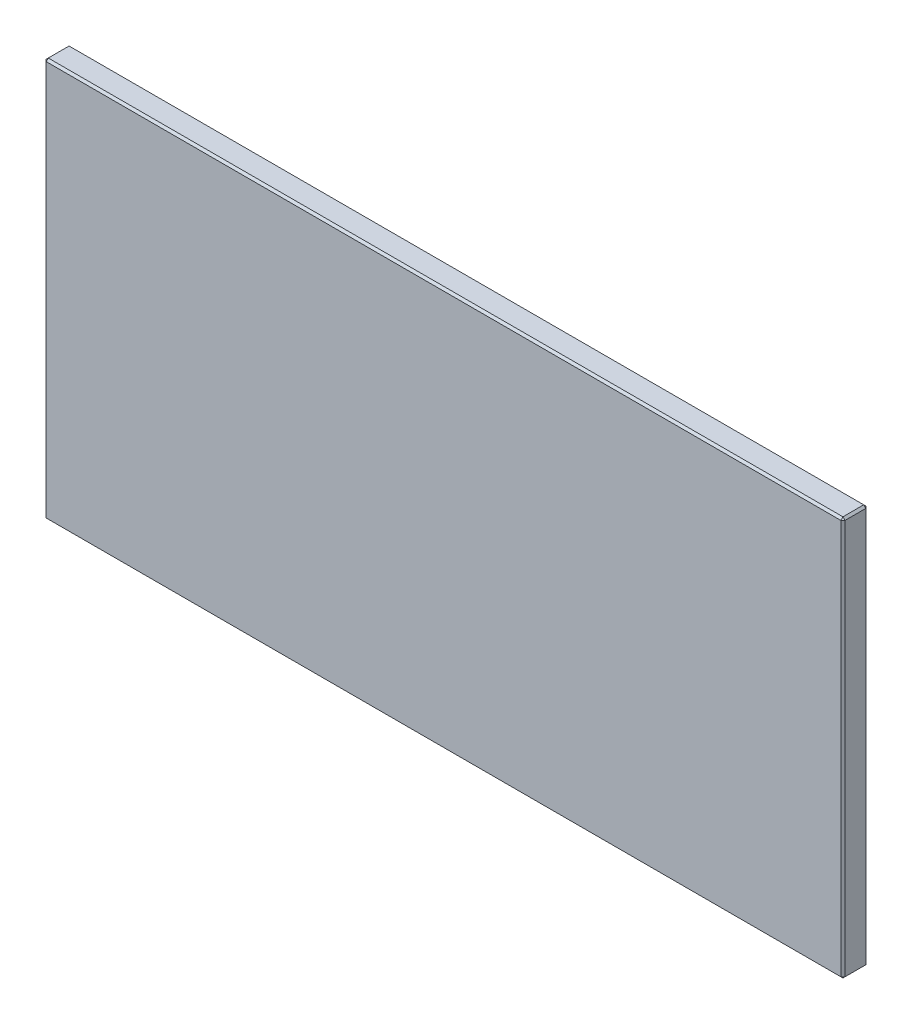
ISO-10303-21;
HEADER;
FILE_DESCRIPTION(('STEP AP214'),'2;1');
FILE_NAME('part.step','',(''),(''),'','','');
FILE_SCHEMA(('AUTOMOTIVE_DESIGN { 1 0 10303 214 1 1 1 1 }'));
ENDSEC;
DATA;
#1=APPLICATION_CONTEXT('core data for automotive mechanical design processes');
#2=APPLICATION_PROTOCOL_DEFINITION('international standard','automotive_design',2000,#1);
#3=PRODUCT_CONTEXT('',#1,'mechanical');
#4=PRODUCT('Part','Part','',(#3));
#5=PRODUCT_RELATED_PRODUCT_CATEGORY('part','',(#4));
#6=PRODUCT_DEFINITION_FORMATION('','',#4);
#7=PRODUCT_DEFINITION_CONTEXT('part definition',#1,'design');
#8=PRODUCT_DEFINITION('design','',#6,#7);
#9=PRODUCT_DEFINITION_SHAPE('','',#8);
#10=(LENGTH_UNIT() NAMED_UNIT(*) SI_UNIT(.MILLI.,.METRE.));
#11=(NAMED_UNIT(*) PLANE_ANGLE_UNIT() SI_UNIT($,.RADIAN.));
#12=(NAMED_UNIT(*) SI_UNIT($,.STERADIAN.) SOLID_ANGLE_UNIT());
#13=UNCERTAINTY_MEASURE_WITH_UNIT(LENGTH_MEASURE(1.E-05),#10,'distance_accuracy_value','');
#14=(GEOMETRIC_REPRESENTATION_CONTEXT(3) GLOBAL_UNCERTAINTY_ASSIGNED_CONTEXT((#13)) GLOBAL_UNIT_ASSIGNED_CONTEXT((#10,
#11,#12)) REPRESENTATION_CONTEXT('',''));
#15=CARTESIAN_POINT('',(0.,0.,0.));
#16=DIRECTION('',(0.,0.,1.));
#17=DIRECTION('',(1.,0.,0.));
#18=AXIS2_PLACEMENT_3D('',#15,#16,#17);
#19=CARTESIAN_POINT('',(-609.6,304.8,38.1));
#20=DIRECTION('',(1.,0.,0.));
#21=DIRECTION('',(0.,1.,0.));
#22=AXIS2_PLACEMENT_3D('',#19,#20,#21);
#23=PLANE('',#22);
#24=DIRECTION('',(0.,1.,0.));
#25=VECTOR('',#24,1.);
#26=CARTESIAN_POINT('',(-609.6,304.8,34.9249999999999));
#27=LINE('',#26,#25);
#28=CARTESIAN_POINT('',(-609.6,-301.625,34.9249999999999));
#29=VERTEX_POINT('',#28);
#30=CARTESIAN_POINT('',(-609.6,301.625,34.9249999999999));
#31=VERTEX_POINT('',#30);
#32=EDGE_CURVE('E41',#29,#31,#27,.T.);
#33=ORIENTED_EDGE('',*,*,#32,.T.);
#34=DIRECTION('',(0.,0.,-1.));
#35=VECTOR('',#34,1.);
#36=CARTESIAN_POINT('',(-609.6,301.625,38.1));
#37=LINE('',#36,#35);
#38=CARTESIAN_POINT('',(-609.6,301.625,3.17500000000005));
#39=VERTEX_POINT('',#38);
#40=EDGE_CURVE('E12',#31,#39,#37,.T.);
#41=ORIENTED_EDGE('',*,*,#40,.T.);
#42=DIRECTION('',(0.,-1.,0.));
#43=VECTOR('',#42,1.);
#44=CARTESIAN_POINT('',(-609.6,304.8,3.17500000000005));
#45=LINE('',#44,#43);
#46=CARTESIAN_POINT('',(-609.6,-301.625,3.17500000000005));
#47=VERTEX_POINT('',#46);
#48=EDGE_CURVE('E193',#39,#47,#45,.T.);
#49=ORIENTED_EDGE('',*,*,#48,.T.);
#50=DIRECTION('',(0.,0.,1.));
#51=VECTOR('',#50,1.);
#52=CARTESIAN_POINT('',(-609.6,-301.625,38.1));
#53=LINE('',#52,#51);
#54=EDGE_CURVE('E51',#47,#29,#53,.T.);
#55=ORIENTED_EDGE('',*,*,#54,.T.);
#56=EDGE_LOOP('',(#33,#41,#49,#55));
#57=FACE_BOUND('',#56,.T.);
#58=ADVANCED_FACE('F34',(#57),#23,.F.);
#59=CARTESIAN_POINT('',(-609.6,-304.8,38.1));
#60=DIRECTION('',(0.,1.,0.));
#61=DIRECTION('',(-1.,0.,0.));
#62=AXIS2_PLACEMENT_3D('',#59,#60,#61);
#63=PLANE('',#62);
#64=DIRECTION('',(0.,0.,1.));
#65=VECTOR('',#64,1.);
#66=CARTESIAN_POINT('',(606.425,-304.8,38.1));
#67=LINE('',#66,#65);
#68=CARTESIAN_POINT('',(606.425,-304.8,3.17500000000005));
#69=VERTEX_POINT('',#68);
#70=CARTESIAN_POINT('',(606.425,-304.8,34.925));
#71=VERTEX_POINT('',#70);
#72=EDGE_CURVE('E179',#69,#71,#67,.T.);
#73=ORIENTED_EDGE('',*,*,#72,.T.);
#74=DIRECTION('',(-1.,0.,0.));
#75=VECTOR('',#74,1.);
#76=CARTESIAN_POINT('',(-609.6,-304.8,34.925));
#77=LINE('',#76,#75);
#78=CARTESIAN_POINT('',(-606.425,-304.8,34.925));
#79=VERTEX_POINT('',#78);
#80=EDGE_CURVE('E181',#71,#79,#77,.T.);
#81=ORIENTED_EDGE('',*,*,#80,.T.);
#82=DIRECTION('',(0.,0.,-1.));
#83=VECTOR('',#82,1.);
#84=CARTESIAN_POINT('',(-606.425,-304.8,38.1));
#85=LINE('',#84,#83);
#86=CARTESIAN_POINT('',(-606.425,-304.8,3.17500000000005));
#87=VERTEX_POINT('',#86);
#88=EDGE_CURVE('E175',#79,#87,#85,.T.);
#89=ORIENTED_EDGE('',*,*,#88,.T.);
#90=DIRECTION('',(1.,0.,0.));
#91=VECTOR('',#90,1.);
#92=CARTESIAN_POINT('',(-609.6,-304.8,3.17500000000005));
#93=LINE('',#92,#91);
#94=EDGE_CURVE('E177',#87,#69,#93,.T.);
#95=ORIENTED_EDGE('',*,*,#94,.T.);
#96=EDGE_LOOP('',(#73,#81,#89,#95));
#97=FACE_BOUND('',#96,.T.);
#98=ADVANCED_FACE('F318',(#97),#63,.F.);
#99=CARTESIAN_POINT('',(609.6,304.8,38.1));
#100=DIRECTION('',(-1.,0.,0.));
#101=DIRECTION('',(0.,0.,1.));
#102=AXIS2_PLACEMENT_3D('',#99,#100,#101);
#103=PLANE('',#102);
#104=DIRECTION('',(0.,0.,1.));
#105=VECTOR('',#104,1.);
#106=CARTESIAN_POINT('',(609.6,301.625,38.1));
#107=LINE('',#106,#105);
#108=CARTESIAN_POINT('',(609.6,301.625,3.17500000000005));
#109=VERTEX_POINT('',#108);
#110=CARTESIAN_POINT('',(609.6,301.625,34.925));
#111=VERTEX_POINT('',#110);
#112=EDGE_CURVE('E170',#109,#111,#107,.T.);
#113=ORIENTED_EDGE('',*,*,#112,.T.);
#114=DIRECTION('',(0.,-1.,0.));
#115=VECTOR('',#114,1.);
#116=CARTESIAN_POINT('',(609.6,-304.8,34.925));
#117=LINE('',#116,#115);
#118=CARTESIAN_POINT('',(609.6,-301.625,34.925));
#119=VERTEX_POINT('',#118);
#120=EDGE_CURVE('E172',#111,#119,#117,.T.);
#121=ORIENTED_EDGE('',*,*,#120,.T.);
#122=DIRECTION('',(0.,0.,-1.));
#123=VECTOR('',#122,1.);
#124=CARTESIAN_POINT('',(609.6,-301.625,38.1));
#125=LINE('',#124,#123);
#126=CARTESIAN_POINT('',(609.6,-301.625,3.17500000000005));
#127=VERTEX_POINT('',#126);
#128=EDGE_CURVE('E168',#119,#127,#125,.T.);
#129=ORIENTED_EDGE('',*,*,#128,.T.);
#130=DIRECTION('',(0.,1.,0.));
#131=VECTOR('',#130,1.);
#132=CARTESIAN_POINT('',(609.6,304.8,3.17500000000005));
#133=LINE('',#132,#131);
#134=EDGE_CURVE('E166',#127,#109,#133,.T.);
#135=ORIENTED_EDGE('',*,*,#134,.T.);
#136=EDGE_LOOP('',(#113,#121,#129,#135));
#137=FACE_BOUND('',#136,.T.);
#138=ADVANCED_FACE('F322',(#137),#103,.F.);
#139=CARTESIAN_POINT('',(-609.6,304.8,38.1));
#140=DIRECTION('',(0.,-1.,0.));
#141=DIRECTION('',(0.,0.,-1.));
#142=AXIS2_PLACEMENT_3D('',#139,#140,#141);
#143=PLANE('',#142);
#144=DIRECTION('',(0.,0.,1.));
#145=VECTOR('',#144,1.);
#146=CARTESIAN_POINT('',(-606.425,304.8,38.1));
#147=LINE('',#146,#145);
#148=CARTESIAN_POINT('',(-606.425,304.8,3.17500000000005));
#149=VERTEX_POINT('',#148);
#150=CARTESIAN_POINT('',(-606.425,304.8,34.925));
#151=VERTEX_POINT('',#150);
#152=EDGE_CURVE('E155',#149,#151,#147,.T.);
#153=ORIENTED_EDGE('',*,*,#152,.T.);
#154=DIRECTION('',(1.,0.,0.));
#155=VECTOR('',#154,1.);
#156=CARTESIAN_POINT('',(609.6,304.8,34.925));
#157=LINE('',#156,#155);
#158=CARTESIAN_POINT('',(606.425,304.8,34.925));
#159=VERTEX_POINT('',#158);
#160=EDGE_CURVE('E127',#151,#159,#157,.T.);
#161=ORIENTED_EDGE('',*,*,#160,.T.);
#162=DIRECTION('',(0.,0.,-1.));
#163=VECTOR('',#162,1.);
#164=CARTESIAN_POINT('',(606.425,304.8,38.1));
#165=LINE('',#164,#163);
#166=CARTESIAN_POINT('',(606.425,304.8,3.17500000000005));
#167=VERTEX_POINT('',#166);
#168=EDGE_CURVE('E163',#159,#167,#165,.T.);
#169=ORIENTED_EDGE('',*,*,#168,.T.);
#170=DIRECTION('',(-1.,0.,0.));
#171=VECTOR('',#170,1.);
#172=CARTESIAN_POINT('',(-609.6,304.8,3.17500000000005));
#173=LINE('',#172,#171);
#174=EDGE_CURVE('E157',#167,#149,#173,.T.);
#175=ORIENTED_EDGE('',*,*,#174,.T.);
#176=EDGE_LOOP('',(#153,#161,#169,#175));
#177=FACE_BOUND('',#176,.T.);
#178=ADVANCED_FACE('F288',(#177),#143,.F.);
#179=CARTESIAN_POINT('',(-609.6,304.8,38.1));
#180=DIRECTION('',(0.,0.,1.));
#181=DIRECTION('',(1.,0.,0.));
#182=AXIS2_PLACEMENT_3D('',#179,#180,#181);
#183=PLANE('',#182);
#184=DIRECTION('',(0.,1.,0.));
#185=VECTOR('',#184,1.);
#186=CARTESIAN_POINT('',(606.425,304.8,38.1));
#187=LINE('',#186,#185);
#188=CARTESIAN_POINT('',(606.425,-301.625,38.1));
#189=VERTEX_POINT('',#188);
#190=CARTESIAN_POINT('',(606.425,301.625,38.1));
#191=VERTEX_POINT('',#190);
#192=EDGE_CURVE('E153',#189,#191,#187,.T.);
#193=ORIENTED_EDGE('',*,*,#192,.T.);
#194=DIRECTION('',(-1.,0.,0.));
#195=VECTOR('',#194,1.);
#196=CARTESIAN_POINT('',(-609.6,301.625,38.1));
#197=LINE('',#196,#195);
#198=CARTESIAN_POINT('',(-606.425,301.625,38.1));
#199=VERTEX_POINT('',#198);
#200=EDGE_CURVE('E125',#191,#199,#197,.T.);
#201=ORIENTED_EDGE('',*,*,#200,.T.);
#202=DIRECTION('',(0.,-1.,0.));
#203=VECTOR('',#202,1.);
#204=CARTESIAN_POINT('',(-606.425,-304.8,38.1));
#205=LINE('',#204,#203);
#206=CARTESIAN_POINT('',(-606.425,-301.625,38.1));
#207=VERTEX_POINT('',#206);
#208=EDGE_CURVE('E142',#199,#207,#205,.T.);
#209=ORIENTED_EDGE('',*,*,#208,.T.);
#210=DIRECTION('',(1.,0.,0.));
#211=VECTOR('',#210,1.);
#212=CARTESIAN_POINT('',(609.6,-301.625,38.1));
#213=LINE('',#212,#211);
#214=EDGE_CURVE('E148',#207,#189,#213,.T.);
#215=ORIENTED_EDGE('',*,*,#214,.T.);
#216=EDGE_LOOP('',(#193,#201,#209,#215));
#217=FACE_BOUND('',#216,.T.);
#218=ADVANCED_FACE('F151',(#217),#183,.T.);
#219=CARTESIAN_POINT('',(-609.6,304.8,0.));
#220=DIRECTION('',(0.,0.,1.));
#221=DIRECTION('',(1.,0.,0.));
#222=AXIS2_PLACEMENT_3D('',#219,#220,#221);
#223=PLANE('',#222);
#224=DIRECTION('',(0.,-1.,0.));
#225=VECTOR('',#224,1.);
#226=CARTESIAN_POINT('',(606.425,304.8,0.));
#227=LINE('',#226,#225);
#228=CARTESIAN_POINT('',(606.425,301.625,0.));
#229=VERTEX_POINT('',#228);
#230=CARTESIAN_POINT('',(606.425,-301.625,0.));
#231=VERTEX_POINT('',#230);
#232=EDGE_CURVE('E188',#229,#231,#227,.T.);
#233=ORIENTED_EDGE('',*,*,#232,.T.);
#234=DIRECTION('',(-1.,0.,0.));
#235=VECTOR('',#234,1.);
#236=CARTESIAN_POINT('',(-609.6,-301.625,0.));
#237=LINE('',#236,#235);
#238=CARTESIAN_POINT('',(-606.425,-301.625,0.));
#239=VERTEX_POINT('',#238);
#240=EDGE_CURVE('E190',#231,#239,#237,.T.);
#241=ORIENTED_EDGE('',*,*,#240,.T.);
#242=DIRECTION('',(0.,1.,0.));
#243=VECTOR('',#242,1.);
#244=CARTESIAN_POINT('',(-606.425,304.8,0.));
#245=LINE('',#244,#243);
#246=CARTESIAN_POINT('',(-606.425,301.625,0.));
#247=VERTEX_POINT('',#246);
#248=EDGE_CURVE('E184',#239,#247,#245,.T.);
#249=ORIENTED_EDGE('',*,*,#248,.T.);
#250=DIRECTION('',(1.,0.,0.));
#251=VECTOR('',#250,1.);
#252=CARTESIAN_POINT('',(-609.6,301.625,0.));
#253=LINE('',#252,#251);
#254=EDGE_CURVE('E186',#247,#229,#253,.T.);
#255=ORIENTED_EDGE('',*,*,#254,.T.);
#256=EDGE_LOOP('',(#233,#241,#249,#255));
#257=FACE_BOUND('',#256,.T.);
#258=ADVANCED_FACE('F302',(#257),#223,.F.);
#259=CARTESIAN_POINT('',(-609.6,-304.8,3.17500000000005));
#260=DIRECTION('',(0.,0.707106781186549,0.707106781186546));
#261=DIRECTION('',(0.,-0.707106781186546,0.707106781186549));
#262=AXIS2_PLACEMENT_3D('',#259,#260,#261);
#263=PLANE('',#262);
#264=DIRECTION('',(0.,-0.707106781186546,0.707106781186549));
#265=VECTOR('',#264,1.);
#266=CARTESIAN_POINT('',(606.425,-303.2125,1.58749999999984));
#267=LINE('',#266,#265);
#268=EDGE_CURVE('E149',#69,#231,#267,.F.);
#269=ORIENTED_EDGE('',*,*,#268,.F.);
#270=ORIENTED_EDGE('',*,*,#94,.F.);
#271=DIRECTION('',(0.,0.707106781186546,-0.707106781186549));
#272=VECTOR('',#271,1.);
#273=CARTESIAN_POINT('',(-606.425,-301.625,0.));
#274=LINE('',#273,#272);
#275=EDGE_CURVE('E211',#239,#87,#274,.F.);
#276=ORIENTED_EDGE('',*,*,#275,.F.);
#277=ORIENTED_EDGE('',*,*,#240,.F.);
#278=EDGE_LOOP('',(#269,#270,#276,#277));
#279=FACE_BOUND('',#278,.T.);
#280=ADVANCED_FACE('F316',(#279),#263,.F.);
#281=CARTESIAN_POINT('',(609.6,-301.625,3.17500000000005));
#282=DIRECTION('',(0.577350269189627,-0.577350269189657,-0.577350269189594));
#283=DIRECTION('',(0.707106781186566,0.707106781186529,0.));
#284=AXIS2_PLACEMENT_3D('',#281,#282,#283);
#285=PLANE('',#284);
#286=DIRECTION('',(0.707106781186566,0.707106781186529,0.));
#287=VECTOR('',#286,1.);
#288=CARTESIAN_POINT('',(609.6,-301.625,3.17500000000005));
#289=LINE('',#288,#287);
#290=EDGE_CURVE('E214',#69,#127,#289,.T.);
#291=ORIENTED_EDGE('',*,*,#290,.F.);
#292=ORIENTED_EDGE('',*,*,#268,.T.);
#293=DIRECTION('',(-0.707106781186534,0.,-0.707106781186561));
#294=VECTOR('',#293,1.);
#295=CARTESIAN_POINT('',(609.6,-301.625,3.17500000000005));
#296=LINE('',#295,#294);
#297=EDGE_CURVE('E255',#127,#231,#296,.T.);
#298=ORIENTED_EDGE('',*,*,#297,.F.);
#299=EDGE_LOOP('',(#291,#292,#298));
#300=FACE_BOUND('',#299,.T.);
#301=ADVANCED_FACE('F311',(#300),#285,.T.);
#302=CARTESIAN_POINT('',(-606.425,-301.625,0.));
#303=DIRECTION('',(-0.577350269189633,-0.577350269189633,-0.577350269189611));
#304=DIRECTION('',(0.707106781186547,-0.707106781186547,0.));
#305=AXIS2_PLACEMENT_3D('',#302,#303,#304);
#306=PLANE('',#305);
#307=DIRECTION('',(-0.707106781186534,0.,0.707106781186561));
#308=VECTOR('',#307,1.);
#309=CARTESIAN_POINT('',(-606.425,-301.625,0.));
#310=LINE('',#309,#308);
#311=EDGE_CURVE('E200',#239,#47,#310,.T.);
#312=ORIENTED_EDGE('',*,*,#311,.F.);
#313=ORIENTED_EDGE('',*,*,#275,.T.);
#314=DIRECTION('',(0.707106781186547,-0.707106781186547,0.));
#315=VECTOR('',#314,1.);
#316=CARTESIAN_POINT('',(-608.0125,-303.2125,3.17500000000005));
#317=LINE('',#316,#315);
#318=EDGE_CURVE('E206',#47,#87,#317,.T.);
#319=ORIENTED_EDGE('',*,*,#318,.F.);
#320=EDGE_LOOP('',(#312,#313,#319));
#321=FACE_BOUND('',#320,.T.);
#322=ADVANCED_FACE('F210',(#321),#306,.T.);
#323=CARTESIAN_POINT('',(609.6,304.8,3.17500000000005));
#324=DIRECTION('',(-0.707106781186561,0.,0.707106781186534));
#325=DIRECTION('',(0.707106781186534,0.,0.707106781186561));
#326=AXIS2_PLACEMENT_3D('',#323,#324,#325);
#327=PLANE('',#326);
#328=ORIENTED_EDGE('',*,*,#297,.T.);
#329=ORIENTED_EDGE('',*,*,#232,.F.);
#330=DIRECTION('',(0.707106781186534,0.,0.707106781186561));
#331=VECTOR('',#330,1.);
#332=CARTESIAN_POINT('',(608.0125,301.625,1.58750000000009));
#333=LINE('',#332,#331);
#334=EDGE_CURVE('E248',#109,#229,#333,.F.);
#335=ORIENTED_EDGE('',*,*,#334,.F.);
#336=ORIENTED_EDGE('',*,*,#134,.F.);
#337=EDGE_LOOP('',(#328,#329,#335,#336));
#338=FACE_BOUND('',#337,.T.);
#339=ADVANCED_FACE('F306',(#338),#327,.F.);
#340=CARTESIAN_POINT('',(609.6,-301.625,38.1));
#341=DIRECTION('',(-0.707106781186529,0.707106781186566,0.));
#342=DIRECTION('',(-0.707106781186566,-0.707106781186529,0.));
#343=AXIS2_PLACEMENT_3D('',#340,#341,#342);
#344=PLANE('',#343);
#345=ORIENTED_EDGE('',*,*,#290,.T.);
#346=ORIENTED_EDGE('',*,*,#128,.F.);
#347=DIRECTION('',(-0.707106781186566,-0.707106781186529,0.));
#348=VECTOR('',#347,1.);
#349=CARTESIAN_POINT('',(609.6,-301.625,34.925));
#350=LINE('',#349,#348);
#351=EDGE_CURVE('E245',#71,#119,#350,.F.);
#352=ORIENTED_EDGE('',*,*,#351,.F.);
#353=ORIENTED_EDGE('',*,*,#72,.F.);
#354=EDGE_LOOP('',(#345,#346,#352,#353));
#355=FACE_BOUND('',#354,.T.);
#356=ADVANCED_FACE('F320',(#355),#344,.F.);
#357=CARTESIAN_POINT('',(-609.6,-301.625,38.1));
#358=DIRECTION('',(0.,-0.707106781186546,0.707106781186549));
#359=DIRECTION('',(0.,-0.707106781186549,-0.707106781186546));
#360=AXIS2_PLACEMENT_3D('',#357,#358,#359);
#361=PLANE('',#360);
#362=DIRECTION('',(0.,0.707106781186549,0.707106781186546));
#363=VECTOR('',#362,1.);
#364=CARTESIAN_POINT('',(-606.425,-304.8,34.925));
#365=LINE('',#364,#363);
#366=EDGE_CURVE('E221',#79,#207,#365,.T.);
#367=ORIENTED_EDGE('',*,*,#366,.F.);
#368=ORIENTED_EDGE('',*,*,#80,.F.);
#369=DIRECTION('',(0.,-0.707106781186549,-0.707106781186546));
#370=VECTOR('',#369,1.);
#371=CARTESIAN_POINT('',(606.425,-303.2125,36.5125000000002));
#372=LINE('',#371,#370);
#373=EDGE_CURVE('E242',#189,#71,#372,.T.);
#374=ORIENTED_EDGE('',*,*,#373,.F.);
#375=ORIENTED_EDGE('',*,*,#214,.F.);
#376=EDGE_LOOP('',(#367,#368,#374,#375));
#377=FACE_BOUND('',#376,.T.);
#378=ADVANCED_FACE('F264',(#377),#361,.T.);
#379=CARTESIAN_POINT('',(-606.425,-304.8,38.1));
#380=DIRECTION('',(0.707106781186548,0.707106781186548,0.));
#381=DIRECTION('',(-0.707106781186548,0.707106781186548,0.));
#382=AXIS2_PLACEMENT_3D('',#379,#380,#381);
#383=PLANE('',#382);
#384=ORIENTED_EDGE('',*,*,#318,.T.);
#385=ORIENTED_EDGE('',*,*,#88,.F.);
#386=DIRECTION('',(-0.707106781186548,0.707106781186548,0.));
#387=VECTOR('',#386,1.);
#388=CARTESIAN_POINT('',(-606.425,-304.8,34.925));
#389=LINE('',#388,#387);
#390=EDGE_CURVE('E217',#29,#79,#389,.F.);
#391=ORIENTED_EDGE('',*,*,#390,.F.);
#392=ORIENTED_EDGE('',*,*,#54,.F.);
#393=EDGE_LOOP('',(#384,#385,#391,#392));
#394=FACE_BOUND('',#393,.T.);
#395=ADVANCED_FACE('F216',(#394),#383,.F.);
#396=CARTESIAN_POINT('',(-609.6,304.8,3.17500000000005));
#397=DIRECTION('',(0.707106781186561,0.,0.707106781186534));
#398=DIRECTION('',(0.707106781186534,0.,-0.707106781186561));
#399=AXIS2_PLACEMENT_3D('',#396,#397,#398);
#400=PLANE('',#399);
#401=ORIENTED_EDGE('',*,*,#311,.T.);
#402=ORIENTED_EDGE('',*,*,#48,.F.);
#403=DIRECTION('',(0.707106781186534,0.,-0.707106781186561));
#404=VECTOR('',#403,1.);
#405=CARTESIAN_POINT('',(-608.0125,301.625,1.58750000000003));
#406=LINE('',#405,#404);
#407=EDGE_CURVE('E222',#247,#39,#406,.F.);
#408=ORIENTED_EDGE('',*,*,#407,.F.);
#409=ORIENTED_EDGE('',*,*,#248,.F.);
#410=EDGE_LOOP('',(#401,#402,#408,#409));
#411=FACE_BOUND('',#410,.T.);
#412=ADVANCED_FACE('F202',(#411),#400,.F.);
#413=CARTESIAN_POINT('',(-609.6,304.8,3.17500000000005));
#414=DIRECTION('',(0.,-0.707106781186549,0.707106781186546));
#415=DIRECTION('',(0.,-0.707106781186546,-0.707106781186549));
#416=AXIS2_PLACEMENT_3D('',#413,#414,#415);
#417=PLANE('',#416);
#418=DIRECTION('',(0.,-0.707106781186546,-0.707106781186549));
#419=VECTOR('',#418,1.);
#420=CARTESIAN_POINT('',(606.425,304.8,3.17500000000005));
#421=LINE('',#420,#419);
#422=EDGE_CURVE('E207',#229,#167,#421,.F.);
#423=ORIENTED_EDGE('',*,*,#422,.F.);
#424=ORIENTED_EDGE('',*,*,#254,.F.);
#425=DIRECTION('',(0.,0.707106781186546,0.707106781186549));
#426=VECTOR('',#425,1.);
#427=CARTESIAN_POINT('',(-606.425,304.8,3.17500000000005));
#428=LINE('',#427,#426);
#429=EDGE_CURVE('E236',#149,#247,#428,.F.);
#430=ORIENTED_EDGE('',*,*,#429,.F.);
#431=ORIENTED_EDGE('',*,*,#174,.F.);
#432=EDGE_LOOP('',(#423,#424,#430,#431));
#433=FACE_BOUND('',#432,.T.);
#434=ADVANCED_FACE('F299',(#433),#417,.F.);
#435=CARTESIAN_POINT('',(606.425,304.8,3.17500000000005));
#436=DIRECTION('',(0.57735026918964,0.57735026918962,-0.577350269189617));
#437=DIRECTION('',(-0.707106781186535,0.70710678118656,0.));
#438=AXIS2_PLACEMENT_3D('',#435,#436,#437);
#439=PLANE('',#438);
#440=ORIENTED_EDGE('',*,*,#334,.T.);
#441=ORIENTED_EDGE('',*,*,#422,.T.);
#442=DIRECTION('',(-0.707106781186535,0.70710678118656,0.));
#443=VECTOR('',#442,1.);
#444=CARTESIAN_POINT('',(606.425,304.8,3.17500000000005));
#445=LINE('',#444,#443);
#446=EDGE_CURVE('E228',#109,#167,#445,.T.);
#447=ORIENTED_EDGE('',*,*,#446,.F.);
#448=EDGE_LOOP('',(#440,#441,#447));
#449=FACE_BOUND('',#448,.T.);
#450=ADVANCED_FACE('F436',(#449),#439,.T.);
#451=CARTESIAN_POINT('',(609.6,-301.625,34.925));
#452=DIRECTION('',(0.577350269189625,-0.577350269189655,0.577350269189597));
#453=DIRECTION('',(0.707106781186566,0.707106781186529,0.));
#454=AXIS2_PLACEMENT_3D('',#451,#452,#453);
#455=PLANE('',#454);
#456=ORIENTED_EDGE('',*,*,#373,.T.);
#457=ORIENTED_EDGE('',*,*,#351,.T.);
#458=DIRECTION('',(-0.707106781186536,0.,0.707106781186558));
#459=VECTOR('',#458,1.);
#460=CARTESIAN_POINT('',(609.6,-301.625,34.925));
#461=LINE('',#460,#459);
#462=EDGE_CURVE('E225',#189,#119,#461,.F.);
#463=ORIENTED_EDGE('',*,*,#462,.F.);
#464=EDGE_LOOP('',(#456,#457,#463));
#465=FACE_BOUND('',#464,.T.);
#466=ADVANCED_FACE('F267',(#465),#455,.T.);
#467=CARTESIAN_POINT('',(-606.425,-304.8,34.925));
#468=DIRECTION('',(-0.577350269189635,-0.57735026918963,0.577350269189612));
#469=DIRECTION('',(0.707106781186544,-0.707106781186551,0.));
#470=AXIS2_PLACEMENT_3D('',#467,#468,#469);
#471=PLANE('',#470);
#472=ORIENTED_EDGE('',*,*,#390,.T.);
#473=ORIENTED_EDGE('',*,*,#366,.T.);
#474=DIRECTION('',(-0.707106781186534,0.,-0.707106781186561));
#475=VECTOR('',#474,1.);
#476=CARTESIAN_POINT('',(-608.0125,-301.625,36.5125));
#477=LINE('',#476,#475);
#478=EDGE_CURVE('E145',#29,#207,#477,.F.);
#479=ORIENTED_EDGE('',*,*,#478,.F.);
#480=EDGE_LOOP('',(#472,#473,#479));
#481=FACE_BOUND('',#480,.T.);
#482=ADVANCED_FACE('F224',(#481),#471,.T.);
#483=CARTESIAN_POINT('',(-606.425,304.8,3.17500000000005));
#484=DIRECTION('',(-0.577350269189633,0.577350269189633,-0.577350269189611));
#485=DIRECTION('',(-0.707106781186547,-0.707106781186547,0.));
#486=AXIS2_PLACEMENT_3D('',#483,#484,#485);
#487=PLANE('',#486);
#488=ORIENTED_EDGE('',*,*,#429,.T.);
#489=ORIENTED_EDGE('',*,*,#407,.T.);
#490=DIRECTION('',(-0.707106781186547,-0.707106781186547,0.));
#491=VECTOR('',#490,1.);
#492=CARTESIAN_POINT('',(-606.425,304.8,3.17500000000005));
#493=LINE('',#492,#491);
#494=EDGE_CURVE('E226',#149,#39,#493,.T.);
#495=ORIENTED_EDGE('',*,*,#494,.F.);
#496=EDGE_LOOP('',(#488,#489,#495));
#497=FACE_BOUND('',#496,.T.);
#498=ADVANCED_FACE('F295',(#497),#487,.T.);
#499=CARTESIAN_POINT('',(606.425,304.8,38.1));
#500=DIRECTION('',(-0.70710678118656,-0.707106781186535,0.));
#501=DIRECTION('',(0.707106781186535,-0.70710678118656,0.));
#502=AXIS2_PLACEMENT_3D('',#499,#500,#501);
#503=PLANE('',#502);
#504=ORIENTED_EDGE('',*,*,#446,.T.);
#505=ORIENTED_EDGE('',*,*,#168,.F.);
#506=DIRECTION('',(0.707106781186535,-0.70710678118656,0.));
#507=VECTOR('',#506,1.);
#508=CARTESIAN_POINT('',(606.425,304.8,34.925));
#509=LINE('',#508,#507);
#510=EDGE_CURVE('E230',#111,#159,#509,.F.);
#511=ORIENTED_EDGE('',*,*,#510,.F.);
#512=ORIENTED_EDGE('',*,*,#112,.F.);
#513=EDGE_LOOP('',(#504,#505,#511,#512));
#514=FACE_BOUND('',#513,.T.);
#515=ADVANCED_FACE('F284',(#514),#503,.F.);
#516=CARTESIAN_POINT('',(606.425,304.8,38.1));
#517=DIRECTION('',(0.707106781186558,0.,0.707106781186537));
#518=DIRECTION('',(0.707106781186537,0.,-0.707106781186558));
#519=AXIS2_PLACEMENT_3D('',#516,#517,#518);
#520=PLANE('',#519);
#521=ORIENTED_EDGE('',*,*,#462,.T.);
#522=ORIENTED_EDGE('',*,*,#120,.F.);
#523=DIRECTION('',(0.707106781186537,0.,-0.707106781186558));
#524=VECTOR('',#523,1.);
#525=CARTESIAN_POINT('',(608.0125,301.625,36.5124999999999));
#526=LINE('',#525,#524);
#527=EDGE_CURVE('E139',#191,#111,#526,.T.);
#528=ORIENTED_EDGE('',*,*,#527,.F.);
#529=ORIENTED_EDGE('',*,*,#192,.F.);
#530=EDGE_LOOP('',(#521,#522,#528,#529));
#531=FACE_BOUND('',#530,.T.);
#532=ADVANCED_FACE('F271',(#531),#520,.T.);
#533=CARTESIAN_POINT('',(-606.425,304.8,38.1));
#534=DIRECTION('',(-0.707106781186561,0.,0.707106781186534));
#535=DIRECTION('',(0.707106781186534,0.,0.707106781186561));
#536=AXIS2_PLACEMENT_3D('',#533,#534,#535);
#537=PLANE('',#536);
#538=ORIENTED_EDGE('',*,*,#478,.T.);
#539=ORIENTED_EDGE('',*,*,#208,.F.);
#540=DIRECTION('',(0.707106781186534,0.,0.707106781186561));
#541=VECTOR('',#540,1.);
#542=CARTESIAN_POINT('',(-606.425,301.625,38.1));
#543=LINE('',#542,#541);
#544=EDGE_CURVE('E133',#31,#199,#543,.T.);
#545=ORIENTED_EDGE('',*,*,#544,.F.);
#546=ORIENTED_EDGE('',*,*,#32,.F.);
#547=EDGE_LOOP('',(#538,#539,#545,#546));
#548=FACE_BOUND('',#547,.T.);
#549=ADVANCED_FACE('F143',(#548),#537,.T.);
#550=CARTESIAN_POINT('',(-609.6,301.625,38.1));
#551=DIRECTION('',(0.707106781186548,-0.707106781186548,0.));
#552=DIRECTION('',(0.707106781186548,0.707106781186548,0.));
#553=AXIS2_PLACEMENT_3D('',#550,#551,#552);
#554=PLANE('',#553);
#555=ORIENTED_EDGE('',*,*,#494,.T.);
#556=ORIENTED_EDGE('',*,*,#40,.F.);
#557=DIRECTION('',(0.707106781186548,0.707106781186548,0.));
#558=VECTOR('',#557,1.);
#559=CARTESIAN_POINT('',(-608.0125,303.2125,34.925));
#560=LINE('',#559,#558);
#561=EDGE_CURVE('E137',#151,#31,#560,.F.);
#562=ORIENTED_EDGE('',*,*,#561,.F.);
#563=ORIENTED_EDGE('',*,*,#152,.F.);
#564=EDGE_LOOP('',(#555,#556,#562,#563));
#565=FACE_BOUND('',#564,.T.);
#566=ADVANCED_FACE('F292',(#565),#554,.F.);
#567=CARTESIAN_POINT('',(606.425,304.8,34.925));
#568=DIRECTION('',(0.577350269189638,0.577350269189618,0.577350269189621));
#569=DIRECTION('',(0.707106781186537,0.,-0.707106781186558));
#570=AXIS2_PLACEMENT_3D('',#567,#568,#569);
#571=PLANE('',#570);
#572=ORIENTED_EDGE('',*,*,#527,.T.);
#573=ORIENTED_EDGE('',*,*,#510,.T.);
#574=DIRECTION('',(0.,-0.707106781186549,0.707106781186546));
#575=VECTOR('',#574,1.);
#576=CARTESIAN_POINT('',(606.425,304.8,34.925));
#577=LINE('',#576,#575);
#578=EDGE_CURVE('E130',#191,#159,#577,.F.);
#579=ORIENTED_EDGE('',*,*,#578,.F.);
#580=EDGE_LOOP('',(#572,#573,#579));
#581=FACE_BOUND('',#580,.T.);
#582=ADVANCED_FACE('F278',(#581),#571,.T.);
#583=CARTESIAN_POINT('',(-606.425,301.625,38.1));
#584=DIRECTION('',(-0.577350269189635,0.57735026918963,0.577350269189612));
#585=DIRECTION('',(-0.707106781186544,-0.707106781186551,0.));
#586=AXIS2_PLACEMENT_3D('',#583,#584,#585);
#587=PLANE('',#586);
#588=ORIENTED_EDGE('',*,*,#561,.T.);
#589=ORIENTED_EDGE('',*,*,#544,.T.);
#590=DIRECTION('',(0.,0.707106781186549,-0.707106781186546));
#591=VECTOR('',#590,1.);
#592=CARTESIAN_POINT('',(-606.425,301.625,38.1));
#593=LINE('',#592,#591);
#594=EDGE_CURVE('E121',#151,#199,#593,.F.);
#595=ORIENTED_EDGE('',*,*,#594,.F.);
#596=EDGE_LOOP('',(#588,#589,#595));
#597=FACE_BOUND('',#596,.T.);
#598=ADVANCED_FACE('F135',(#597),#587,.T.);
#599=CARTESIAN_POINT('',(-609.6,301.625,38.1));
#600=DIRECTION('',(0.,0.707106781186546,0.707106781186549));
#601=DIRECTION('',(0.,-0.707106781186549,0.707106781186546));
#602=AXIS2_PLACEMENT_3D('',#599,#600,#601);
#603=PLANE('',#602);
#604=ORIENTED_EDGE('',*,*,#578,.T.);
#605=ORIENTED_EDGE('',*,*,#160,.F.);
#606=ORIENTED_EDGE('',*,*,#594,.T.);
#607=ORIENTED_EDGE('',*,*,#200,.F.);
#608=EDGE_LOOP('',(#604,#605,#606,#607));
#609=FACE_BOUND('',#608,.T.);
#610=ADVANCED_FACE('F123',(#609),#603,.T.);
#611=CLOSED_SHELL('',(#58,#98,#138,#178,#218,#258,#280,#301,#322,#339,#356,#378,#395,#412,#434,
#450,#466,#482,#498,#515,#532,#549,#566,#582,#598,#610));
#612=MANIFOLD_SOLID_BREP('B2',#611);
#613=ADVANCED_BREP_SHAPE_REPRESENTATION('',(#18,#612),#14);
#614=SHAPE_DEFINITION_REPRESENTATION(#9,#613);
ENDSEC;
END-ISO-10303-21;
